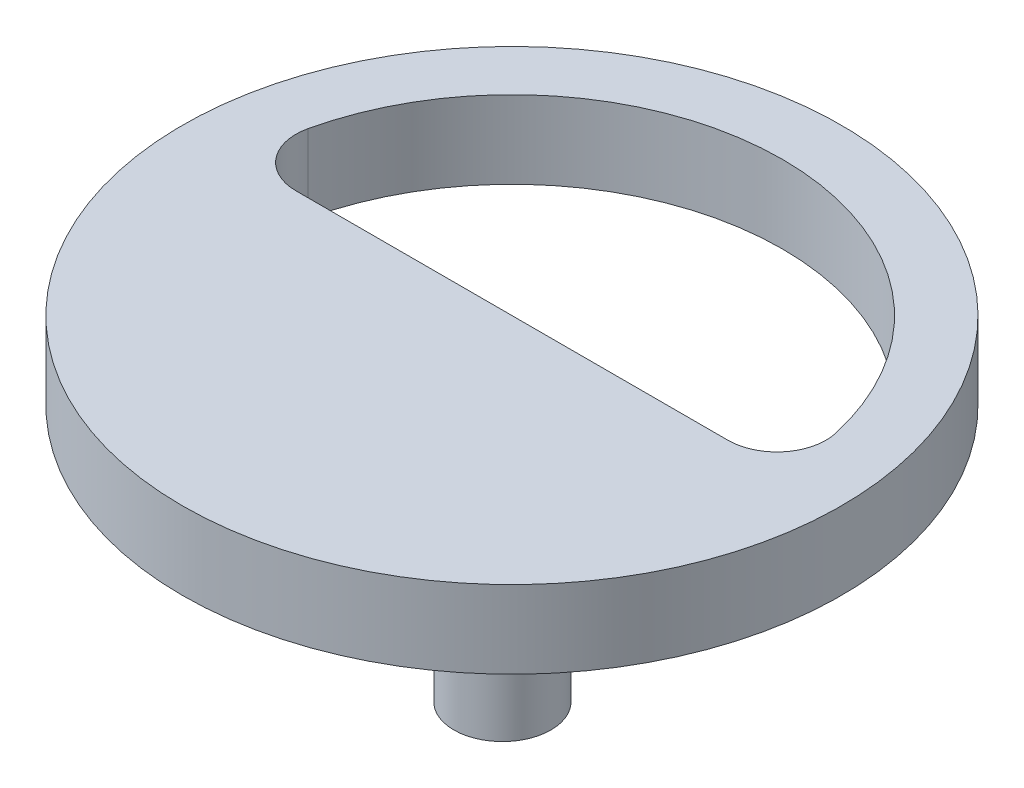
ISO-10303-21;
HEADER;
FILE_DESCRIPTION(('STEP AP214'),'2;1');
FILE_NAME('part.step','',(''),(''),'','','');
FILE_SCHEMA(('AUTOMOTIVE_DESIGN { 1 0 10303 214 1 1 1 1 }'));
ENDSEC;
DATA;
#1=APPLICATION_CONTEXT('core data for automotive mechanical design processes');
#2=APPLICATION_PROTOCOL_DEFINITION('international standard','automotive_design',2000,#1);
#3=PRODUCT_CONTEXT('',#1,'mechanical');
#4=PRODUCT('Part','Part','',(#3));
#5=PRODUCT_RELATED_PRODUCT_CATEGORY('part','',(#4));
#6=PRODUCT_DEFINITION_FORMATION('','',#4);
#7=PRODUCT_DEFINITION_CONTEXT('part definition',#1,'design');
#8=PRODUCT_DEFINITION('design','',#6,#7);
#9=PRODUCT_DEFINITION_SHAPE('','',#8);
#10=(LENGTH_UNIT() NAMED_UNIT(*) SI_UNIT(.MILLI.,.METRE.));
#11=(NAMED_UNIT(*) PLANE_ANGLE_UNIT() SI_UNIT($,.RADIAN.));
#12=(NAMED_UNIT(*) SI_UNIT($,.STERADIAN.) SOLID_ANGLE_UNIT());
#13=UNCERTAINTY_MEASURE_WITH_UNIT(LENGTH_MEASURE(1.E-05),#10,'distance_accuracy_value','');
#14=(GEOMETRIC_REPRESENTATION_CONTEXT(3) GLOBAL_UNCERTAINTY_ASSIGNED_CONTEXT((#13)) GLOBAL_UNIT_ASSIGNED_CONTEXT((#10,
#11,#12)) REPRESENTATION_CONTEXT('',''));
#15=CARTESIAN_POINT('',(0.,0.,0.));
#16=DIRECTION('',(0.,0.,1.));
#17=DIRECTION('',(1.,0.,0.));
#18=AXIS2_PLACEMENT_3D('',#15,#16,#17);
#19=CARTESIAN_POINT('',(0.,2.,0.));
#20=DIRECTION('',(0.,1.,0.));
#21=DIRECTION('',(0.,0.,1.));
#22=AXIS2_PLACEMENT_3D('',#19,#20,#21);
#23=PLANE('',#22);
#24=CARTESIAN_POINT('',(0.,2.,0.));
#25=DIRECTION('',(0.,1.,0.));
#26=DIRECTION('',(0.,0.,1.));
#27=AXIS2_PLACEMENT_3D('',#24,#25,#26);
#28=CIRCLE('',#27,8.49026748061526);
#29=CARTESIAN_POINT('',(0.,2.,8.49026748061526));
#30=VERTEX_POINT('',#29);
#31=EDGE_CURVE('E111',#30,#30,#28,.T.);
#32=ORIENTED_EDGE('',*,*,#31,.T.);
#33=EDGE_LOOP('',(#32));
#34=FACE_BOUND('',#33,.T.);
#35=CARTESIAN_POINT('',(0.,2.,0.));
#36=DIRECTION('',(0.,1.,0.));
#37=DIRECTION('',(0.,0.,1.));
#38=AXIS2_PLACEMENT_3D('',#35,#36,#37);
#39=CIRCLE('',#38,6.96969600000002);
#40=CARTESIAN_POINT('',(6.79698431562278,2.,-1.54196839967429));
#41=VERTEX_POINT('',#40);
#42=CARTESIAN_POINT('',(-6.79698431562281,2.,-1.54196839967415));
#43=VERTEX_POINT('',#42);
#44=EDGE_CURVE('E81',#41,#43,#39,.T.);
#45=ORIENTED_EDGE('',*,*,#44,.F.);
#46=CARTESIAN_POINT('',(5.56564640852992,2.,-1.26262626000006));
#47=DIRECTION('',(0.,1.,0.));
#48=DIRECTION('',(0.,0.,1.));
#49=AXIS2_PLACEMENT_3D('',#46,#47,#48);
#50=CIRCLE('',#49,1.26262626);
#51=CARTESIAN_POINT('',(5.56564640852991,2.,0.));
#52=VERTEX_POINT('',#51);
#53=EDGE_CURVE('E73',#52,#41,#50,.T.);
#54=ORIENTED_EDGE('',*,*,#53,.F.);
#55=DIRECTION('',(1.,0.,0.));
#56=VECTOR('',#55,1.);
#57=CARTESIAN_POINT('',(5.56564640852991,2.,0.));
#58=LINE('',#57,#56);
#59=CARTESIAN_POINT('',(-5.56564640852995,2.,0.));
#60=VERTEX_POINT('',#59);
#61=EDGE_CURVE('E95',#60,#52,#58,.T.);
#62=ORIENTED_EDGE('',*,*,#61,.F.);
#63=CARTESIAN_POINT('',(-5.56564640852995,2.,-1.26262625999994));
#64=DIRECTION('',(0.,1.,0.));
#65=DIRECTION('',(0.,0.,1.));
#66=AXIS2_PLACEMENT_3D('',#63,#64,#65);
#67=CIRCLE('',#66,1.26262626);
#68=EDGE_CURVE('E93',#43,#60,#67,.T.);
#69=ORIENTED_EDGE('',*,*,#68,.F.);
#70=EDGE_LOOP('',(#45,#54,#62,#69));
#71=FACE_BOUND('',#70,.T.);
#72=ADVANCED_FACE('F32',(#34,#71),#23,.T.);
#73=CARTESIAN_POINT('',(0.,0.,0.));
#74=DIRECTION('',(0.,1.,0.));
#75=DIRECTION('',(0.,0.,1.));
#76=AXIS2_PLACEMENT_3D('',#73,#74,#75);
#77=PLANE('',#76);
#78=CARTESIAN_POINT('',(3.99999999999997,0.,4.24513374030766));
#79=DIRECTION('',(0.,1.,0.));
#80=DIRECTION('',(0.,0.,1.));
#81=AXIS2_PLACEMENT_3D('',#78,#79,#80);
#82=CIRCLE('',#81,1.25);
#83=CARTESIAN_POINT('',(3.99999999999997,0.,5.49513374030766));
#84=VERTEX_POINT('',#83);
#85=EDGE_CURVE('E11',#84,#84,#82,.F.);
#86=ORIENTED_EDGE('',*,*,#85,.F.);
#87=EDGE_LOOP('',(#86));
#88=FACE_BOUND('',#87,.T.);
#89=CARTESIAN_POINT('',(-4.00000000000003,0.,4.2451337403076));
#90=DIRECTION('',(0.,1.,0.));
#91=DIRECTION('',(0.,0.,1.));
#92=AXIS2_PLACEMENT_3D('',#89,#90,#91);
#93=CIRCLE('',#92,1.25);
#94=CARTESIAN_POINT('',(-4.00000000000003,0.,5.4951337403076));
#95=VERTEX_POINT('',#94);
#96=EDGE_CURVE('E40',#95,#95,#93,.F.);
#97=ORIENTED_EDGE('',*,*,#96,.F.);
#98=EDGE_LOOP('',(#97));
#99=FACE_BOUND('',#98,.T.);
#100=CARTESIAN_POINT('',(0.,0.,0.));
#101=DIRECTION('',(0.,1.,0.));
#102=DIRECTION('',(0.,0.,1.));
#103=AXIS2_PLACEMENT_3D('',#100,#101,#102);
#104=CIRCLE('',#103,8.49026748061526);
#105=CARTESIAN_POINT('',(0.,0.,8.49026748061526));
#106=VERTEX_POINT('',#105);
#107=EDGE_CURVE('E89',#106,#106,#104,.T.);
#108=ORIENTED_EDGE('',*,*,#107,.F.);
#109=EDGE_LOOP('',(#108));
#110=FACE_BOUND('',#109,.T.);
#111=CARTESIAN_POINT('',(5.56564640852992,0.,-1.26262626000006));
#112=DIRECTION('',(0.,1.,0.));
#113=DIRECTION('',(0.,0.,1.));
#114=AXIS2_PLACEMENT_3D('',#111,#112,#113);
#115=CIRCLE('',#114,1.26262626);
#116=CARTESIAN_POINT('',(5.56564640852991,0.,0.));
#117=VERTEX_POINT('',#116);
#118=CARTESIAN_POINT('',(6.79698431562278,0.,-1.54196839967429));
#119=VERTEX_POINT('',#118);
#120=EDGE_CURVE('E55',#117,#119,#115,.T.);
#121=ORIENTED_EDGE('',*,*,#120,.T.);
#122=CARTESIAN_POINT('',(0.,0.,0.));
#123=DIRECTION('',(0.,1.,0.));
#124=DIRECTION('',(0.,0.,1.));
#125=AXIS2_PLACEMENT_3D('',#122,#123,#124);
#126=CIRCLE('',#125,6.96969600000002);
#127=CARTESIAN_POINT('',(-6.79698431562281,0.,-1.54196839967415));
#128=VERTEX_POINT('',#127);
#129=EDGE_CURVE('E88',#119,#128,#126,.T.);
#130=ORIENTED_EDGE('',*,*,#129,.T.);
#131=CARTESIAN_POINT('',(-5.56564640852995,0.,-1.26262625999994));
#132=DIRECTION('',(0.,1.,0.));
#133=DIRECTION('',(0.,0.,1.));
#134=AXIS2_PLACEMENT_3D('',#131,#132,#133);
#135=CIRCLE('',#134,1.26262626);
#136=CARTESIAN_POINT('',(-5.56564640852995,0.,0.));
#137=VERTEX_POINT('',#136);
#138=EDGE_CURVE('E103',#128,#137,#135,.T.);
#139=ORIENTED_EDGE('',*,*,#138,.T.);
#140=DIRECTION('',(1.,0.,0.));
#141=VECTOR('',#140,1.);
#142=CARTESIAN_POINT('',(5.56564640852991,0.,0.));
#143=LINE('',#142,#141);
#144=EDGE_CURVE('E82',#137,#117,#143,.T.);
#145=ORIENTED_EDGE('',*,*,#144,.T.);
#146=EDGE_LOOP('',(#121,#130,#139,#145));
#147=FACE_BOUND('',#146,.T.);
#148=ADVANCED_FACE('F120',(#88,#99,#110,#147),#77,.F.);
#149=CARTESIAN_POINT('',(0.,2.,0.));
#150=DIRECTION('',(0.,-1.,0.));
#151=DIRECTION('',(0.,0.,-1.));
#152=AXIS2_PLACEMENT_3D('',#149,#150,#151);
#153=CYLINDRICAL_SURFACE('',#152,8.49026748061526);
#154=ORIENTED_EDGE('',*,*,#31,.F.);
#155=EDGE_LOOP('',(#154));
#156=FACE_BOUND('',#155,.T.);
#157=ORIENTED_EDGE('',*,*,#107,.T.);
#158=EDGE_LOOP('',(#157));
#159=FACE_BOUND('',#158,.T.);
#160=ADVANCED_FACE('F34',(#156,#159),#153,.T.);
#161=CARTESIAN_POINT('',(5.56564640852992,2.,-1.26262626000006));
#162=DIRECTION('',(0.,-1.,0.));
#163=DIRECTION('',(0.,0.,-1.));
#164=AXIS2_PLACEMENT_3D('',#161,#162,#163);
#165=CYLINDRICAL_SURFACE('',#164,1.26262626);
#166=ORIENTED_EDGE('',*,*,#120,.F.);
#167=DIRECTION('',(0.,-1.,0.));
#168=VECTOR('',#167,1.);
#169=CARTESIAN_POINT('',(5.56564640852991,2.,0.));
#170=LINE('',#169,#168);
#171=EDGE_CURVE('E77',#52,#117,#170,.T.);
#172=ORIENTED_EDGE('',*,*,#171,.F.);
#173=ORIENTED_EDGE('',*,*,#53,.T.);
#174=DIRECTION('',(0.,-1.,0.));
#175=VECTOR('',#174,1.);
#176=CARTESIAN_POINT('',(6.79698431562278,2.,-1.54196839967429));
#177=LINE('',#176,#175);
#178=EDGE_CURVE('E76',#41,#119,#177,.T.);
#179=ORIENTED_EDGE('',*,*,#178,.T.);
#180=EDGE_LOOP('',(#166,#172,#173,#179));
#181=FACE_BOUND('',#180,.T.);
#182=ADVANCED_FACE('F75',(#181),#165,.F.);
#183=CARTESIAN_POINT('',(0.,2.,0.));
#184=DIRECTION('',(0.,-1.,0.));
#185=DIRECTION('',(0.,0.,-1.));
#186=AXIS2_PLACEMENT_3D('',#183,#184,#185);
#187=CYLINDRICAL_SURFACE('',#186,6.96969600000002);
#188=ORIENTED_EDGE('',*,*,#129,.F.);
#189=ORIENTED_EDGE('',*,*,#178,.F.);
#190=ORIENTED_EDGE('',*,*,#44,.T.);
#191=DIRECTION('',(0.,-1.,0.));
#192=VECTOR('',#191,1.);
#193=CARTESIAN_POINT('',(-6.79698431562281,2.,-1.54196839967415));
#194=LINE('',#193,#192);
#195=EDGE_CURVE('E90',#43,#128,#194,.T.);
#196=ORIENTED_EDGE('',*,*,#195,.T.);
#197=EDGE_LOOP('',(#188,#189,#190,#196));
#198=FACE_BOUND('',#197,.T.);
#199=ADVANCED_FACE('F85',(#198),#187,.F.);
#200=CARTESIAN_POINT('',(-5.56564640852995,2.,-1.26262625999994));
#201=DIRECTION('',(0.,-1.,0.));
#202=DIRECTION('',(0.,0.,-1.));
#203=AXIS2_PLACEMENT_3D('',#200,#201,#202);
#204=CYLINDRICAL_SURFACE('',#203,1.26262626);
#205=ORIENTED_EDGE('',*,*,#138,.F.);
#206=ORIENTED_EDGE('',*,*,#195,.F.);
#207=ORIENTED_EDGE('',*,*,#68,.T.);
#208=DIRECTION('',(0.,-1.,0.));
#209=VECTOR('',#208,1.);
#210=CARTESIAN_POINT('',(-5.56564640852995,2.,0.));
#211=LINE('',#210,#209);
#212=EDGE_CURVE('E47',#60,#137,#211,.T.);
#213=ORIENTED_EDGE('',*,*,#212,.T.);
#214=EDGE_LOOP('',(#205,#206,#207,#213));
#215=FACE_BOUND('',#214,.T.);
#216=ADVANCED_FACE('F129',(#215),#204,.F.);
#217=CARTESIAN_POINT('',(5.56564640852991,2.,0.));
#218=DIRECTION('',(0.,0.,-1.));
#219=DIRECTION('',(-1.,0.,0.));
#220=AXIS2_PLACEMENT_3D('',#217,#218,#219);
#221=PLANE('',#220);
#222=ORIENTED_EDGE('',*,*,#144,.F.);
#223=ORIENTED_EDGE('',*,*,#212,.F.);
#224=ORIENTED_EDGE('',*,*,#61,.T.);
#225=ORIENTED_EDGE('',*,*,#171,.T.);
#226=EDGE_LOOP('',(#222,#223,#224,#225));
#227=FACE_BOUND('',#226,.T.);
#228=ADVANCED_FACE('F127',(#227),#221,.T.);
#229=CARTESIAN_POINT('',(-4.00000000000003,-2.5,4.2451337403076));
#230=DIRECTION('',(0.,1.,0.));
#231=DIRECTION('',(0.,0.,1.));
#232=AXIS2_PLACEMENT_3D('',#229,#230,#231);
#233=CYLINDRICAL_SURFACE('',#232,1.25);
#234=CARTESIAN_POINT('',(-4.00000000000003,-2.5,4.2451337403076));
#235=DIRECTION('',(0.,-1.,0.));
#236=DIRECTION('',(0.,0.,-1.));
#237=AXIS2_PLACEMENT_3D('',#234,#235,#236);
#238=CIRCLE('',#237,1.25);
#239=CARTESIAN_POINT('',(-4.00000000000003,-2.5,2.9951337403076));
#240=VERTEX_POINT('',#239);
#241=EDGE_CURVE('E101',#240,#240,#238,.T.);
#242=ORIENTED_EDGE('',*,*,#241,.F.);
#243=EDGE_LOOP('',(#242));
#244=FACE_BOUND('',#243,.T.);
#245=ORIENTED_EDGE('',*,*,#96,.T.);
#246=EDGE_LOOP('',(#245));
#247=FACE_BOUND('',#246,.T.);
#248=ADVANCED_FACE('F118',(#244,#247),#233,.T.);
#249=CARTESIAN_POINT('',(-4.00000000000003,-2.5,4.2451337403076));
#250=DIRECTION('',(0.,-1.,0.));
#251=DIRECTION('',(0.,0.,-1.));
#252=AXIS2_PLACEMENT_3D('',#249,#250,#251);
#253=PLANE('',#252);
#254=ORIENTED_EDGE('',*,*,#241,.T.);
#255=EDGE_LOOP('',(#254));
#256=FACE_BOUND('',#255,.T.);
#257=ADVANCED_FACE('F135',(#256),#253,.T.);
#258=CARTESIAN_POINT('',(3.99999999999997,-2.5,4.24513374030766));
#259=DIRECTION('',(0.,1.,0.));
#260=DIRECTION('',(0.,0.,1.));
#261=AXIS2_PLACEMENT_3D('',#258,#259,#260);
#262=CYLINDRICAL_SURFACE('',#261,1.25);
#263=CARTESIAN_POINT('',(3.99999999999997,-2.5,4.24513374030766));
#264=DIRECTION('',(0.,-1.,0.));
#265=DIRECTION('',(0.,0.,-1.));
#266=AXIS2_PLACEMENT_3D('',#263,#264,#265);
#267=CIRCLE('',#266,1.25);
#268=CARTESIAN_POINT('',(3.99999999999997,-2.5,2.99513374030766));
#269=VERTEX_POINT('',#268);
#270=EDGE_CURVE('E211',#269,#269,#267,.T.);
#271=ORIENTED_EDGE('',*,*,#270,.F.);
#272=EDGE_LOOP('',(#271));
#273=FACE_BOUND('',#272,.T.);
#274=ORIENTED_EDGE('',*,*,#85,.T.);
#275=EDGE_LOOP('',(#274));
#276=FACE_BOUND('',#275,.T.);
#277=ADVANCED_FACE('F185',(#273,#276),#262,.T.);
#278=CARTESIAN_POINT('',(3.99999999999997,-2.5,4.24513374030766));
#279=DIRECTION('',(0.,-1.,0.));
#280=DIRECTION('',(0.,0.,-1.));
#281=AXIS2_PLACEMENT_3D('',#278,#279,#280);
#282=PLANE('',#281);
#283=ORIENTED_EDGE('',*,*,#270,.T.);
#284=EDGE_LOOP('',(#283));
#285=FACE_BOUND('',#284,.T.);
#286=ADVANCED_FACE('F195',(#285),#282,.T.);
#287=CLOSED_SHELL('',(#72,#148,#160,#182,#199,#216,#228,#248,#257,#277,#286));
#288=MANIFOLD_SOLID_BREP('B2',#287);
#289=ADVANCED_BREP_SHAPE_REPRESENTATION('',(#18,#288),#14);
#290=SHAPE_DEFINITION_REPRESENTATION(#9,#289);
ENDSEC;
END-ISO-10303-21;
